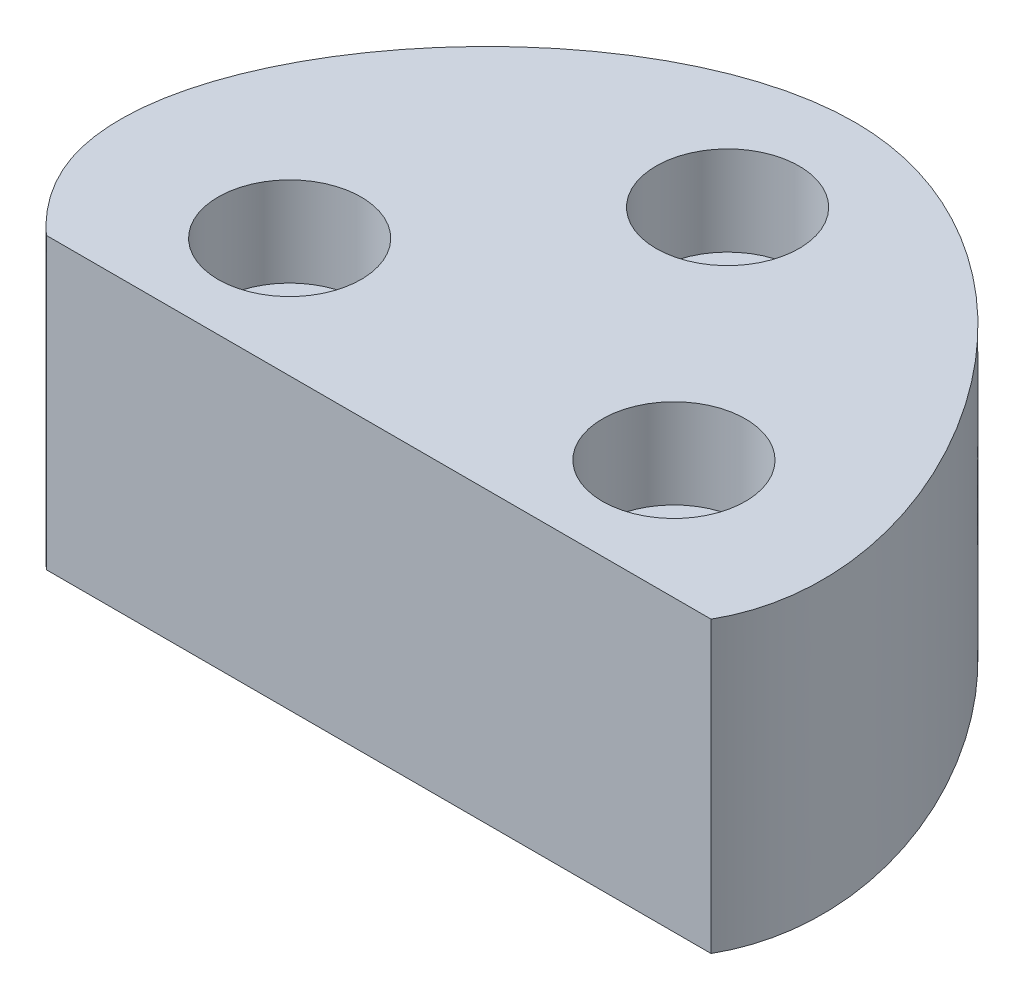
ISO-10303-21;
HEADER;
FILE_DESCRIPTION(('STEP AP214'),'2;1');
FILE_NAME('part.step','',(''),(''),'','','');
FILE_SCHEMA(('AUTOMOTIVE_DESIGN { 1 0 10303 214 1 1 1 1 }'));
ENDSEC;
DATA;
#1=APPLICATION_CONTEXT('core data for automotive mechanical design processes');
#2=APPLICATION_PROTOCOL_DEFINITION('international standard','automotive_design',2000,#1);
#3=PRODUCT_CONTEXT('',#1,'mechanical');
#4=PRODUCT('Part','Part','',(#3));
#5=PRODUCT_RELATED_PRODUCT_CATEGORY('part','',(#4));
#6=PRODUCT_DEFINITION_FORMATION('','',#4);
#7=PRODUCT_DEFINITION_CONTEXT('part definition',#1,'design');
#8=PRODUCT_DEFINITION('design','',#6,#7);
#9=PRODUCT_DEFINITION_SHAPE('','',#8);
#10=(LENGTH_UNIT() NAMED_UNIT(*) SI_UNIT(.MILLI.,.METRE.));
#11=(NAMED_UNIT(*) PLANE_ANGLE_UNIT() SI_UNIT($,.RADIAN.));
#12=(NAMED_UNIT(*) SI_UNIT($,.STERADIAN.) SOLID_ANGLE_UNIT());
#13=UNCERTAINTY_MEASURE_WITH_UNIT(LENGTH_MEASURE(1.E-05),#10,'distance_accuracy_value','');
#14=(GEOMETRIC_REPRESENTATION_CONTEXT(3) GLOBAL_UNCERTAINTY_ASSIGNED_CONTEXT((#13)) GLOBAL_UNIT_ASSIGNED_CONTEXT((#10,
#11,#12)) REPRESENTATION_CONTEXT('',''));
#15=CARTESIAN_POINT('',(0.,0.,0.));
#16=DIRECTION('',(0.,0.,1.));
#17=DIRECTION('',(1.,0.,0.));
#18=AXIS2_PLACEMENT_3D('',#15,#16,#17);
#19=CARTESIAN_POINT('',(0.,16.2,0.));
#20=DIRECTION('',(0.,1.,0.));
#21=DIRECTION('',(0.,0.,1.));
#22=AXIS2_PLACEMENT_3D('',#19,#20,#21);
#23=PLANE('',#22);
#24=CARTESIAN_POINT('',(-10.75,16.2,13.75));
#25=DIRECTION('',(0.,1.,0.));
#26=DIRECTION('',(0.,0.,1.));
#27=AXIS2_PLACEMENT_3D('',#24,#25,#26);
#28=CIRCLE('',#27,4.);
#29=CARTESIAN_POINT('',(-10.75,16.2,17.75));
#30=VERTEX_POINT('',#29);
#31=EDGE_CURVE('E112',#30,#30,#28,.T.);
#32=ORIENTED_EDGE('',*,*,#31,.F.);
#33=EDGE_LOOP('',(#32));
#34=FACE_BOUND('',#33,.T.);
#35=CARTESIAN_POINT('',(10.75,16.2,13.75));
#36=DIRECTION('',(0.,-1.,0.));
#37=DIRECTION('',(0.,0.,1.));
#38=AXIS2_PLACEMENT_3D('',#35,#36,#37);
#39=CIRCLE('',#38,4.);
#40=CARTESIAN_POINT('',(10.75,16.2,17.75));
#41=VERTEX_POINT('',#40);
#42=EDGE_CURVE('E118',#41,#41,#39,.T.);
#43=ORIENTED_EDGE('',*,*,#42,.T.);
#44=EDGE_LOOP('',(#43));
#45=FACE_BOUND('',#44,.T.);
#46=CARTESIAN_POINT('',(0.,16.2,0.));
#47=DIRECTION('',(0.,1.,0.));
#48=DIRECTION('',(0.,0.,1.));
#49=AXIS2_PLACEMENT_3D('',#46,#47,#48);
#50=CIRCLE('',#49,4.);
#51=CARTESIAN_POINT('',(0.,16.2,4.));
#52=VERTEX_POINT('',#51);
#53=EDGE_CURVE('E83',#52,#52,#50,.T.);
#54=ORIENTED_EDGE('',*,*,#53,.F.);
#55=EDGE_LOOP('',(#54));
#56=FACE_BOUND('',#55,.T.);
#57=CARTESIAN_POINT('',(0.,16.2,-7.67151072619957));
#58=CARTESIAN_POINT('',(-11.6762197540645,16.2,-8.15890811091288));
#59=CARTESIAN_POINT('',(-39.7975653135726,16.2,25.7540339386395));
#60=CARTESIAN_POINT('',(38.7332011982261,16.2,33.4890601476254));
#61=CARTESIAN_POINT('',(12.6814987216598,16.2,-7.14215024469352));
#62=CARTESIAN_POINT('',(0.,16.2,-7.67151072619957));
#63=B_SPLINE_CURVE_WITH_KNOTS('',3,(#57,#58,#59,#60,#61,#62),.UNSPECIFIED.,.T.,.F.,(4,1,1,4),
(0.,0.296673026076799,0.677784532992004,1.),.UNSPECIFIED.);
#64=CARTESIAN_POINT('',(19.4913782644413,16.2,20.4169968330856));
#65=VERTEX_POINT('',#64);
#66=CARTESIAN_POINT('',(-17.695652793406,16.2,20.4169968330856));
#67=VERTEX_POINT('',#66);
#68=EDGE_CURVE('E87',#65,#67,#63,.T.);
#69=ORIENTED_EDGE('',*,*,#68,.T.);
#70=DIRECTION('',(1.,0.,0.));
#71=VECTOR('',#70,1.);
#72=CARTESIAN_POINT('',(0.,16.2,20.4169968330856));
#73=LINE('',#72,#71);
#74=EDGE_CURVE('E72',#67,#65,#73,.T.);
#75=ORIENTED_EDGE('',*,*,#74,.T.);
#76=EDGE_LOOP('',(#69,#75));
#77=FACE_BOUND('',#76,.T.);
#78=ADVANCED_FACE('F48',(#34,#45,#56,#77),#23,.T.);
#79=CARTESIAN_POINT('',(0.,0.,0.));
#80=DIRECTION('',(0.,1.,0.));
#81=DIRECTION('',(0.,0.,1.));
#82=AXIS2_PLACEMENT_3D('',#79,#80,#81);
#83=PLANE('',#82);
#84=DIRECTION('',(1.,0.,0.));
#85=VECTOR('',#84,1.);
#86=CARTESIAN_POINT('',(0.,0.,20.4169968330856));
#87=LINE('',#86,#85);
#88=CARTESIAN_POINT('',(-17.695652793406,0.,20.4169968330856));
#89=VERTEX_POINT('',#88);
#90=CARTESIAN_POINT('',(19.4913782644413,0.,20.4169968330856));
#91=VERTEX_POINT('',#90);
#92=EDGE_CURVE('E12',#89,#91,#87,.T.);
#93=ORIENTED_EDGE('',*,*,#92,.F.);
#94=CARTESIAN_POINT('',(0.,0.,-7.67151072619957));
#95=CARTESIAN_POINT('',(-11.6762197540645,0.,-8.15890811091288));
#96=CARTESIAN_POINT('',(-39.7975653135726,0.,25.7540339386395));
#97=CARTESIAN_POINT('',(38.7332011982261,0.,33.4890601476254));
#98=CARTESIAN_POINT('',(12.6814987216598,0.,-7.14215024469352));
#99=CARTESIAN_POINT('',(0.,0.,-7.67151072619957));
#100=B_SPLINE_CURVE_WITH_KNOTS('',3,(#94,#95,#96,#97,#98,#99),.UNSPECIFIED.,.T.,.F.,(4,1,1,4),
(0.,0.296673026076799,0.677784532992004,1.),.UNSPECIFIED.);
#101=EDGE_CURVE('E59',#91,#89,#100,.T.);
#102=ORIENTED_EDGE('',*,*,#101,.F.);
#103=EDGE_LOOP('',(#93,#102));
#104=FACE_BOUND('',#103,.T.);
#105=ADVANCED_FACE('F50',(#104),#83,.F.);
#106=CARTESIAN_POINT('',(-10.75,11.2,13.75));
#107=DIRECTION('',(0.,1.,0.));
#108=DIRECTION('',(0.,0.,1.));
#109=AXIS2_PLACEMENT_3D('',#106,#107,#108);
#110=CYLINDRICAL_SURFACE('',#109,4.);
#111=CARTESIAN_POINT('',(-10.75,11.2,13.75));
#112=DIRECTION('',(0.,1.,0.));
#113=DIRECTION('',(0.,0.,1.));
#114=AXIS2_PLACEMENT_3D('',#111,#112,#113);
#115=CIRCLE('',#114,4.);
#116=CARTESIAN_POINT('',(-10.75,11.2,17.75));
#117=VERTEX_POINT('',#116);
#118=EDGE_CURVE('E108',#117,#117,#115,.T.);
#119=ORIENTED_EDGE('',*,*,#118,.F.);
#120=EDGE_LOOP('',(#119));
#121=FACE_BOUND('',#120,.T.);
#122=ORIENTED_EDGE('',*,*,#31,.T.);
#123=EDGE_LOOP('',(#122));
#124=FACE_BOUND('',#123,.T.);
#125=ADVANCED_FACE('F161',(#121,#124),#110,.F.);
#126=CARTESIAN_POINT('',(-10.75,11.2,13.75));
#127=DIRECTION('',(0.,1.,0.));
#128=DIRECTION('',(0.,0.,1.));
#129=AXIS2_PLACEMENT_3D('',#126,#127,#128);
#130=PLANE('',#129);
#131=ORIENTED_EDGE('',*,*,#118,.T.);
#132=EDGE_LOOP('',(#131));
#133=FACE_BOUND('',#132,.T.);
#134=ADVANCED_FACE('F157',(#133),#130,.T.);
#135=CARTESIAN_POINT('',(10.75,11.2,13.75));
#136=DIRECTION('',(0.,1.,0.));
#137=DIRECTION('',(0.,0.,1.));
#138=AXIS2_PLACEMENT_3D('',#135,#136,#137);
#139=CYLINDRICAL_SURFACE('',#138,4.);
#140=CARTESIAN_POINT('',(10.75,11.2,13.75));
#141=DIRECTION('',(0.,-1.,0.));
#142=DIRECTION('',(0.,0.,1.));
#143=AXIS2_PLACEMENT_3D('',#140,#141,#142);
#144=CIRCLE('',#143,4.);
#145=CARTESIAN_POINT('',(10.75,11.2,17.75));
#146=VERTEX_POINT('',#145);
#147=EDGE_CURVE('E115',#146,#146,#144,.T.);
#148=ORIENTED_EDGE('',*,*,#147,.T.);
#149=EDGE_LOOP('',(#148));
#150=FACE_BOUND('',#149,.T.);
#151=ORIENTED_EDGE('',*,*,#42,.F.);
#152=EDGE_LOOP('',(#151));
#153=FACE_BOUND('',#152,.T.);
#154=ADVANCED_FACE('F153',(#150,#153),#139,.F.);
#155=CARTESIAN_POINT('',(10.75,11.2,13.75));
#156=DIRECTION('',(0.,1.,0.));
#157=DIRECTION('',(0.,0.,1.));
#158=AXIS2_PLACEMENT_3D('',#155,#156,#157);
#159=PLANE('',#158);
#160=ORIENTED_EDGE('',*,*,#147,.F.);
#161=EDGE_LOOP('',(#160));
#162=FACE_BOUND('',#161,.T.);
#163=ADVANCED_FACE('F149',(#162),#159,.T.);
#164=CARTESIAN_POINT('',(0.,11.2,0.));
#165=DIRECTION('',(0.,1.,0.));
#166=DIRECTION('',(0.,0.,1.));
#167=AXIS2_PLACEMENT_3D('',#164,#165,#166);
#168=CYLINDRICAL_SURFACE('',#167,4.);
#169=CARTESIAN_POINT('',(0.,11.2,0.));
#170=DIRECTION('',(0.,1.,0.));
#171=DIRECTION('',(0.,0.,1.));
#172=AXIS2_PLACEMENT_3D('',#169,#170,#171);
#173=CIRCLE('',#172,4.);
#174=CARTESIAN_POINT('',(0.,11.2,4.));
#175=VERTEX_POINT('',#174);
#176=EDGE_CURVE('E121',#175,#175,#173,.T.);
#177=ORIENTED_EDGE('',*,*,#176,.F.);
#178=EDGE_LOOP('',(#177));
#179=FACE_BOUND('',#178,.T.);
#180=ORIENTED_EDGE('',*,*,#53,.T.);
#181=EDGE_LOOP('',(#180));
#182=FACE_BOUND('',#181,.T.);
#183=ADVANCED_FACE('F145',(#179,#182),#168,.F.);
#184=CARTESIAN_POINT('',(0.,11.2,0.));
#185=DIRECTION('',(0.,1.,0.));
#186=DIRECTION('',(0.,0.,1.));
#187=AXIS2_PLACEMENT_3D('',#184,#185,#186);
#188=PLANE('',#187);
#189=ORIENTED_EDGE('',*,*,#176,.T.);
#190=EDGE_LOOP('',(#189));
#191=FACE_BOUND('',#190,.T.);
#192=ADVANCED_FACE('F141',(#191),#188,.T.);
#193=CARTESIAN_POINT('',(0.,-3.8,-7.67151072619957));
#194=CARTESIAN_POINT('',(-11.6762197540645,-3.8,-8.15890811091288));
#195=CARTESIAN_POINT('',(-39.7975653135726,-3.8,25.7540339386395));
#196=CARTESIAN_POINT('',(38.7332011982261,-3.8,33.4890601476254));
#197=CARTESIAN_POINT('',(12.6814987216598,-3.8,-7.14215024469352));
#198=CARTESIAN_POINT('',(0.,-3.8,-7.67151072619957));
#199=B_SPLINE_CURVE_WITH_KNOTS('',3,(#193,#194,#195,#196,#197,#198),.UNSPECIFIED.,.T.,.F.,(4,1,
1,4),(0.,0.296673026076799,0.677784532992004,1.),.UNSPECIFIED.);
#200=DIRECTION('',(0.,1.,0.));
#201=VECTOR('',#200,1.);
#202=SURFACE_OF_LINEAR_EXTRUSION('',#199,#201);
#203=ORIENTED_EDGE('',*,*,#101,.T.);
#204=CARTESIAN_POINT('',(-17.695652793408,0.,20.4169968330878));
#205=DIRECTION('',(0.,1.,0.));
#206=VECTOR('',#205,1.);
#207=LINE('',#204,#206);
#208=EDGE_CURVE('E66',#89,#67,#207,.T.);
#209=ORIENTED_EDGE('',*,*,#208,.T.);
#210=ORIENTED_EDGE('',*,*,#68,.F.);
#211=DIRECTION('',(0.,1.,0.));
#212=VECTOR('',#211,1.);
#213=CARTESIAN_POINT('',(19.4913782644413,-3.8,20.4169968330856));
#214=LINE('',#213,#212);
#215=EDGE_CURVE('E77',#91,#65,#214,.T.);
#216=ORIENTED_EDGE('',*,*,#215,.F.);
#217=EDGE_LOOP('',(#203,#209,#210,#216));
#218=FACE_BOUND('',#217,.T.);
#219=ADVANCED_FACE('F89',(#218),#202,.T.);
#220=CARTESIAN_POINT('',(0.,-3.8,20.4169968330856));
#221=DIRECTION('',(0.,0.,1.));
#222=DIRECTION('',(1.,0.,0.));
#223=AXIS2_PLACEMENT_3D('',#220,#221,#222);
#224=PLANE('',#223);
#225=ORIENTED_EDGE('',*,*,#92,.T.);
#226=ORIENTED_EDGE('',*,*,#215,.T.);
#227=ORIENTED_EDGE('',*,*,#74,.F.);
#228=ORIENTED_EDGE('',*,*,#208,.F.);
#229=EDGE_LOOP('',(#225,#226,#227,#228));
#230=FACE_BOUND('',#229,.T.);
#231=ADVANCED_FACE('F78',(#230),#224,.T.);
#232=CLOSED_SHELL('',(#78,#105,#125,#134,#154,#163,#183,#192,#219,#231));
#233=MANIFOLD_SOLID_BREP('B2',#232);
#234=ADVANCED_BREP_SHAPE_REPRESENTATION('',(#18,#233),#14);
#235=SHAPE_DEFINITION_REPRESENTATION(#9,#234);
ENDSEC;
END-ISO-10303-21;
